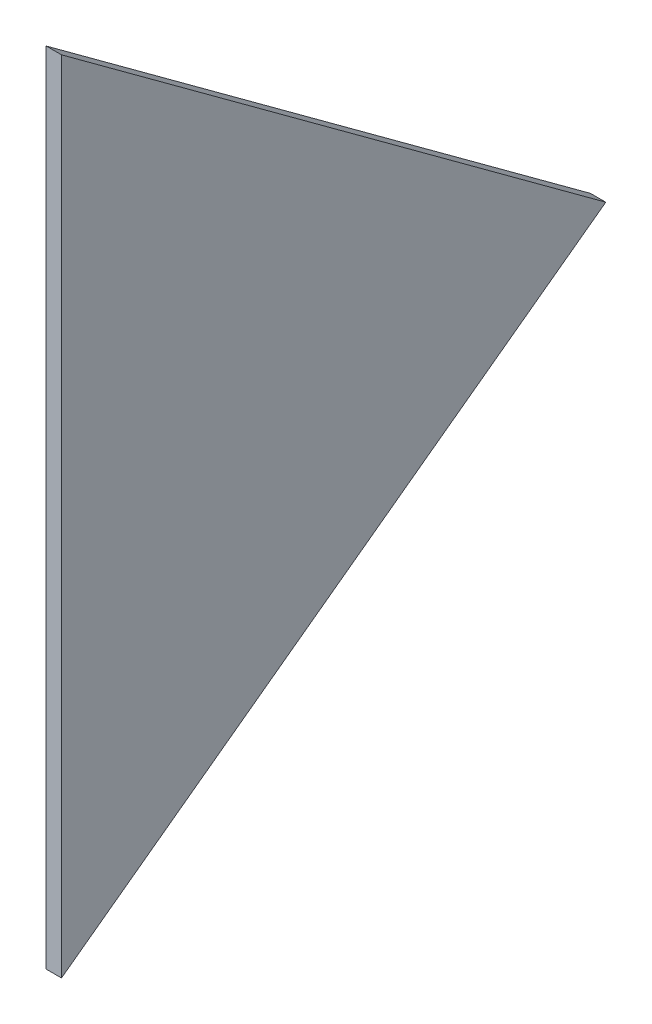
ISO-10303-21;
HEADER;
FILE_DESCRIPTION(('STEP AP214'),'2;1');
FILE_NAME('part.step','',(''),(''),'','','');
FILE_SCHEMA(('AUTOMOTIVE_DESIGN { 1 0 10303 214 1 1 1 1 }'));
ENDSEC;
DATA;
#1=APPLICATION_CONTEXT('core data for automotive mechanical design processes');
#2=APPLICATION_PROTOCOL_DEFINITION('international standard','automotive_design',2000,#1);
#3=PRODUCT_CONTEXT('',#1,'mechanical');
#4=PRODUCT('Part','Part','',(#3));
#5=PRODUCT_RELATED_PRODUCT_CATEGORY('part','',(#4));
#6=PRODUCT_DEFINITION_FORMATION('','',#4);
#7=PRODUCT_DEFINITION_CONTEXT('part definition',#1,'design');
#8=PRODUCT_DEFINITION('design','',#6,#7);
#9=PRODUCT_DEFINITION_SHAPE('','',#8);
#10=(LENGTH_UNIT() NAMED_UNIT(*) SI_UNIT(.MILLI.,.METRE.));
#11=(NAMED_UNIT(*) PLANE_ANGLE_UNIT() SI_UNIT($,.RADIAN.));
#12=(NAMED_UNIT(*) SI_UNIT($,.STERADIAN.) SOLID_ANGLE_UNIT());
#13=UNCERTAINTY_MEASURE_WITH_UNIT(LENGTH_MEASURE(1.E-05),#10,'distance_accuracy_value','');
#14=(GEOMETRIC_REPRESENTATION_CONTEXT(3) GLOBAL_UNCERTAINTY_ASSIGNED_CONTEXT((#13)) GLOBAL_UNIT_ASSIGNED_CONTEXT((#10,
#11,#12)) REPRESENTATION_CONTEXT('',''));
#15=CARTESIAN_POINT('',(0.,0.,0.));
#16=DIRECTION('',(0.,0.,1.));
#17=DIRECTION('',(1.,0.,0.));
#18=AXIS2_PLACEMENT_3D('',#15,#16,#17);
#19=CARTESIAN_POINT('',(79.814001175587,65.508019879158,0.911302619695));
#20=DIRECTION('',(0.999999999999996,8.74227767955197E-08,0.));
#21=DIRECTION('',(-8.74227767955197E-08,0.999999999999996,0.));
#22=AXIS2_PLACEMENT_3D('',#19,#20,#21);
#23=PLANE('',#22);
#24=DIRECTION('',(0.,0.591955733274022,-0.80597047703003));
#25=VECTOR('',#24,1.);
#26=CARTESIAN_POINT('',(79.814001175587,65.1158726514568,1.07899683039564));
#27=LINE('',#26,#25);
#28=CARTESIAN_POINT('',(79.8140011670165,65.5080198790429,0.545073311595556));
#29=VERTEX_POINT('',#28);
#30=CARTESIAN_POINT('',(79.8140011927284,65.1158726515884,1.07899682977008));
#31=VERTEX_POINT('',#30);
#32=EDGE_CURVE('E20',#29,#31,#27,.F.);
#33=ORIENTED_EDGE('',*,*,#32,.F.);
#34=DIRECTION('',(0.,0.591955733274022,0.80597047703003));
#35=VECTOR('',#34,1.);
#36=CARTESIAN_POINT('',(79.814001141305,65.5080198786978,0.545073310813362));
#37=LINE('',#36,#35);
#38=CARTESIAN_POINT('',(79.8140011584459,65.9001671062841,1.07899682961365));
#39=VERTEX_POINT('',#38);
#40=EDGE_CURVE('E53',#39,#29,#37,.F.);
#41=ORIENTED_EDGE('',*,*,#40,.F.);
#42=DIRECTION('',(0.,-1.,0.));
#43=VECTOR('',#42,1.);
#44=CARTESIAN_POINT('',(79.81400120987,65.900167105088,1.07899682977));
#45=LINE('',#44,#43);
#46=EDGE_CURVE('E60',#31,#39,#45,.F.);
#47=ORIENTED_EDGE('',*,*,#46,.F.);
#48=EDGE_LOOP('',(#33,#41,#47));
#49=FACE_BOUND('',#48,.T.);
#50=ADVANCED_FACE('F17',(#49),#23,.T.);
#51=CARTESIAN_POINT('',(79.79900120987,65.115872650605,1.07899682977));
#52=DIRECTION('',(7.04601771171925E-08,-0.805970477030028,-0.591955733274021));
#53=DIRECTION('',(0.,0.591955733274022,-0.80597047703003));
#54=AXIS2_PLACEMENT_3D('',#51,#52,#53);
#55=PLANE('',#54);
#56=ORIENTED_EDGE('',*,*,#32,.T.);
#57=DIRECTION('',(1.,0.,0.));
#58=VECTOR('',#57,1.);
#59=CARTESIAN_POINT('',(79.799001141305,65.115872650605,1.07899682977));
#60=LINE('',#59,#58);
#61=CARTESIAN_POINT('',(79.7990011927287,65.1158726508347,1.07899682945726));
#62=VERTEX_POINT('',#61);
#63=EDGE_CURVE('E64',#62,#31,#60,.T.);
#64=ORIENTED_EDGE('',*,*,#63,.F.);
#65=DIRECTION('',(-5.17504215129157E-08,0.591955733273471,-0.805970477030433));
#66=VECTOR('',#65,1.);
#67=CARTESIAN_POINT('',(79.7990012098696,65.115872650605,1.07899682977));
#68=LINE('',#67,#66);
#69=CARTESIAN_POINT('',(79.7990011927285,65.5080198779611,0.545073311595624));
#70=VERTEX_POINT('',#69);
#71=EDGE_CURVE('E63',#62,#70,#68,.T.);
#72=ORIENTED_EDGE('',*,*,#71,.T.);
#73=DIRECTION('',(0.999999999999998,5.67888225627641E-08,-4.17093058120252E-08));
#74=VECTOR('',#73,1.);
#75=CARTESIAN_POINT('',(79.799001175587,65.5080198783057,0.545073312064957));
#76=LINE('',#75,#74);
#77=EDGE_CURVE('E56',#29,#70,#76,.F.);
#78=ORIENTED_EDGE('',*,*,#77,.F.);
#79=EDGE_LOOP('',(#56,#64,#72,#78));
#80=FACE_BOUND('',#79,.T.);
#81=ADVANCED_FACE('F62',(#80),#55,.T.);
#82=CARTESIAN_POINT('',(79.799001175587,65.508019877846,0.545073311439));
#83=DIRECTION('',(-7.04601771171925E-08,0.805970477030028,-0.591955733274021));
#84=DIRECTION('',(0.,0.591955733274022,0.80597047703003));
#85=AXIS2_PLACEMENT_3D('',#82,#83,#84);
#86=PLANE('',#85);
#87=ORIENTED_EDGE('',*,*,#40,.T.);
#88=ORIENTED_EDGE('',*,*,#77,.T.);
#89=DIRECTION('',(-5.17504215128682E-08,0.591955733274478,0.805970477029694));
#90=VECTOR('',#89,1.);
#91=CARTESIAN_POINT('',(79.799001175587,65.508019877846,0.545073311439));
#92=LINE('',#91,#90);
#93=CARTESIAN_POINT('',(79.7990011584458,65.9001671054156,1.07899682977011));
#94=VERTEX_POINT('',#93);
#95=EDGE_CURVE('E26',#70,#94,#92,.T.);
#96=ORIENTED_EDGE('',*,*,#95,.T.);
#97=DIRECTION('',(1.,0.,0.));
#98=VECTOR('',#97,1.);
#99=CARTESIAN_POINT('',(79.799001141305,65.900167106399,1.07899682977));
#100=LINE('',#99,#98);
#101=EDGE_CURVE('E34',#39,#94,#100,.F.);
#102=ORIENTED_EDGE('',*,*,#101,.F.);
#103=EDGE_LOOP('',(#87,#88,#96,#102));
#104=FACE_BOUND('',#103,.T.);
#105=ADVANCED_FACE('F54',(#104),#86,.T.);
#106=CARTESIAN_POINT('',(79.799001141305,65.900167105088,1.07899682977));
#107=DIRECTION('',(0.,0.,1.));
#108=DIRECTION('',(0.,-1.,0.));
#109=AXIS2_PLACEMENT_3D('',#106,#107,#108);
#110=PLANE('',#109);
#111=ORIENTED_EDGE('',*,*,#46,.T.);
#112=ORIENTED_EDGE('',*,*,#101,.T.);
#113=DIRECTION('',(-8.74227767955197E-08,0.999999999999996,0.));
#114=VECTOR('',#113,1.);
#115=CARTESIAN_POINT('',(79.799001175587,65.508019877846,1.07899682977));
#116=LINE('',#115,#114);
#117=EDGE_CURVE('E11',#94,#62,#116,.F.);
#118=ORIENTED_EDGE('',*,*,#117,.T.);
#119=ORIENTED_EDGE('',*,*,#63,.T.);
#120=EDGE_LOOP('',(#111,#112,#118,#119));
#121=FACE_BOUND('',#120,.T.);
#122=ADVANCED_FACE('F73',(#121),#110,.T.);
#123=CARTESIAN_POINT('',(79.799001175587,65.508019877846,0.911302619695));
#124=DIRECTION('',(0.999999999999996,8.74227767955197E-08,0.));
#125=DIRECTION('',(-8.74227767955197E-08,0.999999999999996,0.));
#126=AXIS2_PLACEMENT_3D('',#123,#124,#125);
#127=PLANE('',#126);
#128=ORIENTED_EDGE('',*,*,#95,.F.);
#129=ORIENTED_EDGE('',*,*,#71,.F.);
#130=ORIENTED_EDGE('',*,*,#117,.F.);
#131=EDGE_LOOP('',(#128,#129,#130));
#132=FACE_BOUND('',#131,.T.);
#133=ADVANCED_FACE('F72',(#132),#127,.F.);
#134=CLOSED_SHELL('',(#50,#81,#105,#122,#133));
#135=MANIFOLD_SOLID_BREP('B1',#134);
#136=ADVANCED_BREP_SHAPE_REPRESENTATION('',(#18,#135),#14);
#137=SHAPE_DEFINITION_REPRESENTATION(#9,#136);
ENDSEC;
END-ISO-10303-21;
